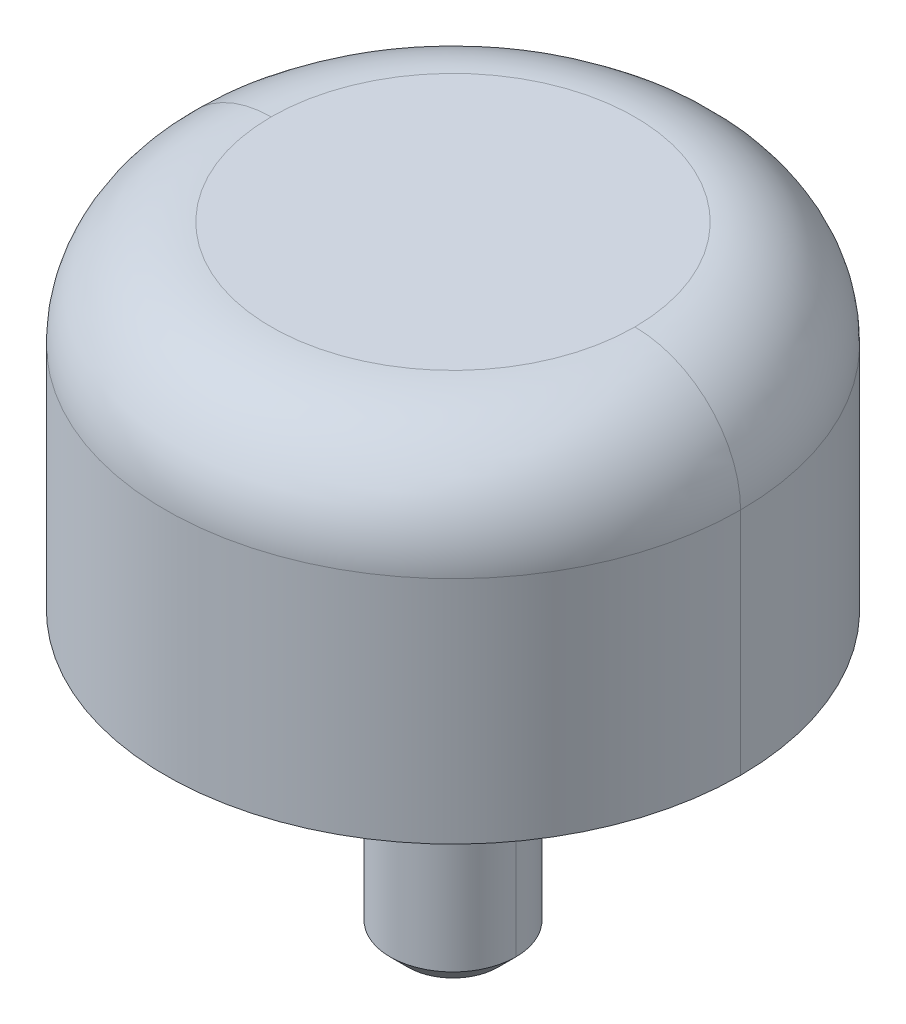
ISO-10303-21;
HEADER;
FILE_DESCRIPTION(('STEP AP214'),'2;1');
FILE_NAME('part.step','',(''),(''),'','','');
FILE_SCHEMA(('AUTOMOTIVE_DESIGN { 1 0 10303 214 1 1 1 1 }'));
ENDSEC;
DATA;
#1=APPLICATION_CONTEXT('core data for automotive mechanical design processes');
#2=APPLICATION_PROTOCOL_DEFINITION('international standard','automotive_design',2000,#1);
#3=PRODUCT_CONTEXT('',#1,'mechanical');
#4=PRODUCT('Part','Part','',(#3));
#5=PRODUCT_RELATED_PRODUCT_CATEGORY('part','',(#4));
#6=PRODUCT_DEFINITION_FORMATION('','',#4);
#7=PRODUCT_DEFINITION_CONTEXT('part definition',#1,'design');
#8=PRODUCT_DEFINITION('design','',#6,#7);
#9=PRODUCT_DEFINITION_SHAPE('','',#8);
#10=(LENGTH_UNIT() NAMED_UNIT(*) SI_UNIT(.MILLI.,.METRE.));
#11=(NAMED_UNIT(*) PLANE_ANGLE_UNIT() SI_UNIT($,.RADIAN.));
#12=(NAMED_UNIT(*) SI_UNIT($,.STERADIAN.) SOLID_ANGLE_UNIT());
#13=UNCERTAINTY_MEASURE_WITH_UNIT(LENGTH_MEASURE(1.E-05),#10,'distance_accuracy_value','');
#14=(GEOMETRIC_REPRESENTATION_CONTEXT(3) GLOBAL_UNCERTAINTY_ASSIGNED_CONTEXT((#13)) GLOBAL_UNIT_ASSIGNED_CONTEXT((#10,
#11,#12)) REPRESENTATION_CONTEXT('',''));
#15=CARTESIAN_POINT('',(0.,0.,0.));
#16=DIRECTION('',(0.,0.,1.));
#17=DIRECTION('',(1.,0.,0.));
#18=AXIS2_PLACEMENT_3D('',#15,#16,#17);
#19=CARTESIAN_POINT('',(7.04426666666667,0.,0.));
#20=DIRECTION('',(0.,1.,0.));
#21=DIRECTION('',(1.,0.,0.));
#22=AXIS2_PLACEMENT_3D('',#19,#20,#21);
#23=PLANE('',#22);
#24=CARTESIAN_POINT('',(0.,0.,0.));
#25=DIRECTION('',(0.,-1.,0.));
#26=DIRECTION('',(1.,0.,0.));
#27=AXIS2_PLACEMENT_3D('',#24,#25,#26);
#28=CIRCLE('',#27,2.24155);
#29=CARTESIAN_POINT('',(2.24155,0.,0.));
#30=VERTEX_POINT('',#29);
#31=CARTESIAN_POINT('',(-2.24155,0.,0.));
#32=VERTEX_POINT('',#31);
#33=EDGE_CURVE('P0_E39',#30,#32,#28,.T.);
#34=ORIENTED_EDGE('',*,*,#33,.F.);
#35=CARTESIAN_POINT('',(0.,0.,0.));
#36=DIRECTION('',(0.,-1.,0.));
#37=DIRECTION('',(1.,0.,0.));
#38=AXIS2_PLACEMENT_3D('',#35,#36,#37);
#39=CIRCLE('',#38,2.24155);
#40=EDGE_CURVE('P0_E114',#32,#30,#39,.T.);
#41=ORIENTED_EDGE('',*,*,#40,.F.);
#42=EDGE_LOOP('',(#34,#41));
#43=FACE_BOUND('',#42,.T.);
#44=CARTESIAN_POINT('',(0.,0.,0.));
#45=DIRECTION('',(0.,1.,0.));
#46=DIRECTION('',(-1.,0.,0.));
#47=AXIS2_PLACEMENT_3D('',#44,#45,#46);
#48=CIRCLE('',#47,9.525);
#49=CARTESIAN_POINT('',(-9.525,0.,0.));
#50=VERTEX_POINT('',#49);
#51=CARTESIAN_POINT('',(9.525,0.,0.));
#52=VERTEX_POINT('',#51);
#53=EDGE_CURVE('P0_E149',#50,#52,#48,.T.);
#54=ORIENTED_EDGE('',*,*,#53,.F.);
#55=CARTESIAN_POINT('',(0.,0.,0.));
#56=DIRECTION('',(0.,1.,0.));
#57=DIRECTION('',(-1.,0.,0.));
#58=AXIS2_PLACEMENT_3D('',#55,#56,#57);
#59=CIRCLE('',#58,9.525);
#60=EDGE_CURVE('P0_E11',#52,#50,#59,.T.);
#61=ORIENTED_EDGE('',*,*,#60,.F.);
#62=EDGE_LOOP('',(#54,#61));
#63=FACE_BOUND('',#62,.T.);
#64=ADVANCED_FACE('P0_F16',(#43,#63),#23,.F.);
#65=CARTESIAN_POINT('',(0.,11.1125,0.));
#66=DIRECTION('',(0.,1.,0.));
#67=DIRECTION('',(-1.,0.,0.));
#68=AXIS2_PLACEMENT_3D('',#65,#66,#67);
#69=CYLINDRICAL_SURFACE('',#68,9.525);
#70=DIRECTION('',(0.,1.,0.));
#71=VECTOR('',#70,1.);
#72=CARTESIAN_POINT('',(9.525,11.1125,0.));
#73=LINE('',#72,#71);
#74=CARTESIAN_POINT('',(9.525,7.6125,0.));
#75=VERTEX_POINT('',#74);
#76=EDGE_CURVE('P0_E153',#52,#75,#73,.T.);
#77=ORIENTED_EDGE('',*,*,#76,.F.);
#78=ORIENTED_EDGE('',*,*,#60,.T.);
#79=DIRECTION('',(0.,1.,0.));
#80=VECTOR('',#79,1.);
#81=CARTESIAN_POINT('',(-9.525,11.1125,0.));
#82=LINE('',#81,#80);
#83=CARTESIAN_POINT('',(-9.525,7.6125,0.));
#84=VERTEX_POINT('',#83);
#85=EDGE_CURVE('P0_E148',#50,#84,#82,.T.);
#86=ORIENTED_EDGE('',*,*,#85,.T.);
#87=CARTESIAN_POINT('',(0.,7.6125,0.));
#88=DIRECTION('',(0.,1.,0.));
#89=DIRECTION('',(-1.,0.,0.));
#90=AXIS2_PLACEMENT_3D('',#87,#88,#89);
#91=CIRCLE('',#90,9.525);
#92=EDGE_CURVE('P0_E26',#75,#84,#91,.T.);
#93=ORIENTED_EDGE('',*,*,#92,.F.);
#94=EDGE_LOOP('',(#77,#78,#86,#93));
#95=FACE_BOUND('',#94,.T.);
#96=ADVANCED_FACE('P0_F210',(#95),#69,.T.);
#97=CARTESIAN_POINT('',(0.,7.6125,0.));
#98=DIRECTION('',(0.,1.,0.));
#99=DIRECTION('',(-1.,0.,0.));
#100=AXIS2_PLACEMENT_3D('',#97,#98,#99);
#101=TOROIDAL_SURFACE('',#100,6.025,3.5);
#102=CARTESIAN_POINT('',(6.025,7.6125,0.));
#103=DIRECTION('',(0.,0.,1.));
#104=DIRECTION('',(1.,0.,0.));
#105=AXIS2_PLACEMENT_3D('',#102,#103,#104);
#106=CIRCLE('',#105,3.5);
#107=CARTESIAN_POINT('',(6.025,11.1125,0.));
#108=VERTEX_POINT('',#107);
#109=EDGE_CURVE('P0_E143',#75,#108,#106,.T.);
#110=ORIENTED_EDGE('',*,*,#109,.F.);
#111=ORIENTED_EDGE('',*,*,#92,.T.);
#112=CARTESIAN_POINT('',(-6.025,7.6125,0.));
#113=DIRECTION('',(0.,0.,-1.));
#114=DIRECTION('',(-1.,0.,0.));
#115=AXIS2_PLACEMENT_3D('',#112,#113,#114);
#116=CIRCLE('',#115,3.5);
#117=CARTESIAN_POINT('',(-6.025,11.1125,0.));
#118=VERTEX_POINT('',#117);
#119=EDGE_CURVE('P0_E163',#84,#118,#116,.T.);
#120=ORIENTED_EDGE('',*,*,#119,.T.);
#121=CARTESIAN_POINT('',(0.,11.1125,0.));
#122=DIRECTION('',(0.,1.,0.));
#123=DIRECTION('',(-1.,0.,0.));
#124=AXIS2_PLACEMENT_3D('',#121,#122,#123);
#125=CIRCLE('',#124,6.025);
#126=EDGE_CURVE('P0_E139',#108,#118,#125,.T.);
#127=ORIENTED_EDGE('',*,*,#126,.F.);
#128=EDGE_LOOP('',(#110,#111,#120,#127));
#129=FACE_BOUND('',#128,.T.);
#130=ADVANCED_FACE('P0_F204',(#129),#101,.T.);
#131=CARTESIAN_POINT('',(0.,11.1125,0.));
#132=DIRECTION('',(0.,-1.,0.));
#133=DIRECTION('',(-1.,0.,0.));
#134=AXIS2_PLACEMENT_3D('',#131,#132,#133);
#135=PLANE('',#134);
#136=CARTESIAN_POINT('',(0.,11.1125,0.));
#137=DIRECTION('',(0.,1.,0.));
#138=DIRECTION('',(-1.,0.,0.));
#139=AXIS2_PLACEMENT_3D('',#136,#137,#138);
#140=CIRCLE('',#139,6.025);
#141=EDGE_CURVE('P0_E147',#118,#108,#140,.T.);
#142=ORIENTED_EDGE('',*,*,#141,.T.);
#143=ORIENTED_EDGE('',*,*,#126,.T.);
#144=EDGE_LOOP('',(#142,#143));
#145=FACE_BOUND('',#144,.T.);
#146=ADVANCED_FACE('P0_F199',(#145),#135,.F.);
#147=CARTESIAN_POINT('',(0.,-9.525,0.));
#148=DIRECTION('',(0.,-1.,0.));
#149=DIRECTION('',(1.,0.,0.));
#150=AXIS2_PLACEMENT_3D('',#147,#148,#149);
#151=CYLINDRICAL_SURFACE('',#150,2.0828);
#152=DIRECTION('',(0.,-1.,0.));
#153=VECTOR('',#152,1.);
#154=CARTESIAN_POINT('',(-2.0828,-9.525,0.));
#155=LINE('',#154,#153);
#156=CARTESIAN_POINT('',(-2.0828,5.205419462737,0.));
#157=VERTEX_POINT('',#156);
#158=CARTESIAN_POINT('',(-2.0828,0.15875,0.));
#159=VERTEX_POINT('',#158);
#160=EDGE_CURVE('P0_E127',#157,#159,#155,.T.);
#161=ORIENTED_EDGE('',*,*,#160,.F.);
#162=CARTESIAN_POINT('',(0.,5.205419462737,0.));
#163=DIRECTION('',(0.,-1.,0.));
#164=DIRECTION('',(1.,0.,0.));
#165=AXIS2_PLACEMENT_3D('',#162,#163,#164);
#166=CIRCLE('',#165,2.0828);
#167=CARTESIAN_POINT('',(2.0828,5.205419462737,0.));
#168=VERTEX_POINT('',#167);
#169=EDGE_CURVE('P0_E20',#168,#157,#166,.T.);
#170=ORIENTED_EDGE('',*,*,#169,.F.);
#171=DIRECTION('',(0.,-1.,0.));
#172=VECTOR('',#171,1.);
#173=CARTESIAN_POINT('',(2.0828,-9.525,0.));
#174=LINE('',#173,#172);
#175=CARTESIAN_POINT('',(2.0828,0.15875,0.));
#176=VERTEX_POINT('',#175);
#177=EDGE_CURVE('P0_E118',#168,#176,#174,.T.);
#178=ORIENTED_EDGE('',*,*,#177,.T.);
#179=CARTESIAN_POINT('',(0.,0.15875,0.));
#180=DIRECTION('',(0.,-1.,0.));
#181=DIRECTION('',(1.,0.,0.));
#182=AXIS2_PLACEMENT_3D('',#179,#180,#181);
#183=CIRCLE('',#182,2.0828);
#184=EDGE_CURVE('P0_E96',#176,#159,#183,.T.);
#185=ORIENTED_EDGE('',*,*,#184,.T.);
#186=EDGE_LOOP('',(#161,#170,#178,#185));
#187=FACE_BOUND('',#186,.T.);
#188=ADVANCED_FACE('P0_F18',(#187),#151,.F.);
#189=CARTESIAN_POINT('',(0.,5.205419462737,0.));
#190=DIRECTION('',(0.,-1.,0.));
#191=DIRECTION('',(1.,0.,0.));
#192=AXIS2_PLACEMENT_3D('',#189,#190,#191);
#193=CONICAL_SURFACE('',#192,2.0828,1.22173047639603);
#194=DIRECTION('',(-0.939692620785907,-0.342020143325671,0.));
#195=VECTOR('',#194,1.);
#196=CARTESIAN_POINT('',(-2.0828,5.205419462737,0.));
#197=LINE('',#196,#195);
#198=CARTESIAN_POINT('',(0.,5.96349666666665,0.));
#199=VERTEX_POINT('',#198);
#200=EDGE_CURVE('P0_E158',#199,#157,#197,.T.);
#201=ORIENTED_EDGE('',*,*,#200,.F.);
#202=DIRECTION('',(0.939692620785907,-0.342020143325671,0.));
#203=VECTOR('',#202,1.);
#204=CARTESIAN_POINT('',(2.0828,5.205419462737,0.));
#205=LINE('',#204,#203);
#206=EDGE_CURVE('P0_E124',#199,#168,#205,.T.);
#207=ORIENTED_EDGE('',*,*,#206,.T.);
#208=ORIENTED_EDGE('',*,*,#169,.T.);
#209=EDGE_LOOP('',(#201,#207,#208));
#210=FACE_BOUND('',#209,.T.);
#211=ADVANCED_FACE('P0_F229',(#210),#193,.F.);
#212=CARTESIAN_POINT('',(0.,0.,0.));
#213=DIRECTION('',(0.,-1.,0.));
#214=DIRECTION('',(1.,0.,0.));
#215=AXIS2_PLACEMENT_3D('',#212,#213,#214);
#216=CONICAL_SURFACE('',#215,2.24155,0.785398163397446);
#217=DIRECTION('',(-0.707106781186546,-0.707106781186549,0.));
#218=VECTOR('',#217,1.);
#219=CARTESIAN_POINT('',(-2.24155,0.,0.));
#220=LINE('',#219,#218);
#221=EDGE_CURVE('P0_E102',#159,#32,#220,.T.);
#222=ORIENTED_EDGE('',*,*,#221,.F.);
#223=ORIENTED_EDGE('',*,*,#184,.F.);
#224=DIRECTION('',(0.707106781186546,-0.707106781186549,0.));
#225=VECTOR('',#224,1.);
#226=CARTESIAN_POINT('',(2.24155,0.,0.));
#227=LINE('',#226,#225);
#228=EDGE_CURVE('P0_E99',#176,#30,#227,.T.);
#229=ORIENTED_EDGE('',*,*,#228,.T.);
#230=ORIENTED_EDGE('',*,*,#33,.T.);
#231=EDGE_LOOP('',(#222,#223,#229,#230));
#232=FACE_BOUND('',#231,.T.);
#233=ADVANCED_FACE('P0_F98',(#232),#216,.F.);
#234=CARTESIAN_POINT('',(0.,0.,0.));
#235=DIRECTION('',(0.,-1.,0.));
#236=DIRECTION('',(1.,0.,0.));
#237=AXIS2_PLACEMENT_3D('',#234,#235,#236);
#238=CONICAL_SURFACE('',#237,2.24155,0.785398163397446);
#239=CARTESIAN_POINT('',(0.,0.15875,0.));
#240=DIRECTION('',(0.,-1.,0.));
#241=DIRECTION('',(1.,0.,0.));
#242=AXIS2_PLACEMENT_3D('',#239,#240,#241);
#243=CIRCLE('',#242,2.0828);
#244=EDGE_CURVE('P0_E112',#159,#176,#243,.T.);
#245=ORIENTED_EDGE('',*,*,#244,.F.);
#246=ORIENTED_EDGE('',*,*,#221,.T.);
#247=ORIENTED_EDGE('',*,*,#40,.T.);
#248=ORIENTED_EDGE('',*,*,#228,.F.);
#249=EDGE_LOOP('',(#245,#246,#247,#248));
#250=FACE_BOUND('',#249,.T.);
#251=ADVANCED_FACE('P0_F110',(#250),#238,.F.);
#252=CARTESIAN_POINT('',(0.,5.205419462737,0.));
#253=DIRECTION('',(0.,-1.,0.));
#254=DIRECTION('',(1.,0.,0.));
#255=AXIS2_PLACEMENT_3D('',#252,#253,#254);
#256=CONICAL_SURFACE('',#255,2.0828,1.22173047639603);
#257=ORIENTED_EDGE('',*,*,#206,.F.);
#258=ORIENTED_EDGE('',*,*,#200,.T.);
#259=CARTESIAN_POINT('',(0.,5.205419462737,0.));
#260=DIRECTION('',(0.,-1.,0.));
#261=DIRECTION('',(1.,0.,0.));
#262=AXIS2_PLACEMENT_3D('',#259,#260,#261);
#263=CIRCLE('',#262,2.0828);
#264=EDGE_CURVE('P0_E135',#157,#168,#263,.T.);
#265=ORIENTED_EDGE('',*,*,#264,.T.);
#266=EDGE_LOOP('',(#257,#258,#265));
#267=FACE_BOUND('',#266,.T.);
#268=ADVANCED_FACE('P0_F221',(#267),#256,.F.);
#269=CARTESIAN_POINT('',(0.,-9.525,0.));
#270=DIRECTION('',(0.,-1.,0.));
#271=DIRECTION('',(1.,0.,0.));
#272=AXIS2_PLACEMENT_3D('',#269,#270,#271);
#273=CYLINDRICAL_SURFACE('',#272,2.0828);
#274=ORIENTED_EDGE('',*,*,#264,.F.);
#275=ORIENTED_EDGE('',*,*,#160,.T.);
#276=ORIENTED_EDGE('',*,*,#244,.T.);
#277=ORIENTED_EDGE('',*,*,#177,.F.);
#278=EDGE_LOOP('',(#274,#275,#276,#277));
#279=FACE_BOUND('',#278,.T.);
#280=ADVANCED_FACE('P0_F126',(#279),#273,.F.);
#281=CARTESIAN_POINT('',(0.,7.6125,0.));
#282=DIRECTION('',(0.,1.,0.));
#283=DIRECTION('',(-1.,0.,0.));
#284=AXIS2_PLACEMENT_3D('',#281,#282,#283);
#285=TOROIDAL_SURFACE('',#284,6.025,3.5);
#286=CARTESIAN_POINT('',(0.,7.6125,0.));
#287=DIRECTION('',(0.,1.,0.));
#288=DIRECTION('',(-1.,0.,0.));
#289=AXIS2_PLACEMENT_3D('',#286,#287,#288);
#290=CIRCLE('',#289,9.525);
#291=EDGE_CURVE('P0_E155',#84,#75,#290,.T.);
#292=ORIENTED_EDGE('',*,*,#291,.T.);
#293=ORIENTED_EDGE('',*,*,#109,.T.);
#294=ORIENTED_EDGE('',*,*,#141,.F.);
#295=ORIENTED_EDGE('',*,*,#119,.F.);
#296=EDGE_LOOP('',(#292,#293,#294,#295));
#297=FACE_BOUND('',#296,.T.);
#298=ADVANCED_FACE('P0_F206',(#297),#285,.T.);
#299=CARTESIAN_POINT('',(0.,11.1125,0.));
#300=DIRECTION('',(0.,1.,0.));
#301=DIRECTION('',(-1.,0.,0.));
#302=AXIS2_PLACEMENT_3D('',#299,#300,#301);
#303=CYLINDRICAL_SURFACE('',#302,9.525);
#304=ORIENTED_EDGE('',*,*,#53,.T.);
#305=ORIENTED_EDGE('',*,*,#76,.T.);
#306=ORIENTED_EDGE('',*,*,#291,.F.);
#307=ORIENTED_EDGE('',*,*,#85,.F.);
#308=EDGE_LOOP('',(#304,#305,#306,#307));
#309=FACE_BOUND('',#308,.T.);
#310=ADVANCED_FACE('P0_F209',(#309),#303,.T.);
#311=CLOSED_SHELL('',(#64,#96,#130,#146,#188,#211,#233,#251,#268,#280,#298,#310));
#312=MANIFOLD_SOLID_BREP('P0_B1',#311);
#313=CARTESIAN_POINT('',(0.,-9.525,0.));
#314=DIRECTION('',(0.,1.,0.));
#315=DIRECTION('',(-1.,0.,0.));
#316=AXIS2_PLACEMENT_3D('',#313,#314,#315);
#317=CONICAL_SURFACE('',#316,1.48748750000001,0.785398163397447);
#318=DIRECTION('',(0.707106781186547,0.707106781186549,0.));
#319=VECTOR('',#318,1.);
#320=CARTESIAN_POINT('',(1.4874875,-9.525,0.));
#321=LINE('',#320,#319);
#322=CARTESIAN_POINT('',(1.4874875,-9.525,0.));
#323=VERTEX_POINT('',#322);
#324=CARTESIAN_POINT('',(2.0828,-8.92968750000001,0.));
#325=VERTEX_POINT('',#324);
#326=EDGE_CURVE('P1_E93',#323,#325,#321,.T.);
#327=ORIENTED_EDGE('',*,*,#326,.F.);
#328=CARTESIAN_POINT('',(0.,-9.525,0.));
#329=DIRECTION('',(0.,-1.,0.));
#330=DIRECTION('',(1.,0.,0.));
#331=AXIS2_PLACEMENT_3D('',#328,#329,#330);
#332=CIRCLE('',#331,1.48748750000001);
#333=CARTESIAN_POINT('',(-1.48748750000001,-9.525,0.));
#334=VERTEX_POINT('',#333);
#335=EDGE_CURVE('P1_E85',#334,#323,#332,.T.);
#336=ORIENTED_EDGE('',*,*,#335,.F.);
#337=DIRECTION('',(-0.707106781186547,0.707106781186549,0.));
#338=VECTOR('',#337,1.);
#339=CARTESIAN_POINT('',(-1.48748750000001,-9.525,0.));
#340=LINE('',#339,#338);
#341=CARTESIAN_POINT('',(-2.0828,-8.92968750000001,0.));
#342=VERTEX_POINT('',#341);
#343=EDGE_CURVE('P1_E83',#334,#342,#340,.T.);
#344=ORIENTED_EDGE('',*,*,#343,.T.);
#345=CARTESIAN_POINT('',(0.,-8.92968750000001,0.));
#346=DIRECTION('',(0.,1.,0.));
#347=DIRECTION('',(1.,0.,0.));
#348=AXIS2_PLACEMENT_3D('',#345,#346,#347);
#349=CIRCLE('',#348,2.0828);
#350=EDGE_CURVE('P1_E11',#325,#342,#349,.T.);
#351=ORIENTED_EDGE('',*,*,#350,.F.);
#352=EDGE_LOOP('',(#327,#336,#344,#351));
#353=FACE_BOUND('',#352,.T.);
#354=ADVANCED_FACE('P1_F16',(#353),#317,.T.);
#355=CARTESIAN_POINT('',(0.,5.205419462737,0.));
#356=DIRECTION('',(0.,-1.,0.));
#357=DIRECTION('',(1.,0.,0.));
#358=AXIS2_PLACEMENT_3D('',#355,#356,#357);
#359=CONICAL_SURFACE('',#358,2.0828,1.22173047639603);
#360=DIRECTION('',(-0.939692620785907,-0.342020143325671,0.));
#361=VECTOR('',#360,1.);
#362=CARTESIAN_POINT('',(-2.0828,5.205419462737,0.));
#363=LINE('',#362,#361);
#364=CARTESIAN_POINT('',(0.,5.96349666666665,0.));
#365=VERTEX_POINT('',#364);
#366=CARTESIAN_POINT('',(-2.0828,5.205419462737,0.));
#367=VERTEX_POINT('',#366);
#368=EDGE_CURVE('P1_E104',#365,#367,#363,.T.);
#369=ORIENTED_EDGE('',*,*,#368,.F.);
#370=DIRECTION('',(0.939692620785907,-0.342020143325671,0.));
#371=VECTOR('',#370,1.);
#372=CARTESIAN_POINT('',(2.0828,5.205419462737,0.));
#373=LINE('',#372,#371);
#374=CARTESIAN_POINT('',(2.0828,5.205419462737,0.));
#375=VERTEX_POINT('',#374);
#376=EDGE_CURVE('P1_E90',#365,#375,#373,.T.);
#377=ORIENTED_EDGE('',*,*,#376,.T.);
#378=CARTESIAN_POINT('',(0.,5.205419462737,0.));
#379=DIRECTION('',(0.,-1.,0.));
#380=DIRECTION('',(1.,0.,0.));
#381=AXIS2_PLACEMENT_3D('',#378,#379,#380);
#382=CIRCLE('',#381,2.0828);
#383=EDGE_CURVE('P1_E27',#367,#375,#382,.T.);
#384=ORIENTED_EDGE('',*,*,#383,.F.);
#385=EDGE_LOOP('',(#369,#377,#384));
#386=FACE_BOUND('',#385,.T.);
#387=ADVANCED_FACE('P1_F219',(#386),#359,.T.);
#388=CARTESIAN_POINT('',(0.,-9.525,0.));
#389=DIRECTION('',(0.,-1.,0.));
#390=DIRECTION('',(1.,0.,0.));
#391=AXIS2_PLACEMENT_3D('',#388,#389,#390);
#392=CYLINDRICAL_SURFACE('',#391,2.0828);
#393=DIRECTION('',(0.,-1.,0.));
#394=VECTOR('',#393,1.);
#395=CARTESIAN_POINT('',(-2.0828,-9.525,0.));
#396=LINE('',#395,#394);
#397=EDGE_CURVE('P1_E69',#367,#342,#396,.T.);
#398=ORIENTED_EDGE('',*,*,#397,.F.);
#399=ORIENTED_EDGE('',*,*,#383,.T.);
#400=DIRECTION('',(0.,-1.,0.));
#401=VECTOR('',#400,1.);
#402=CARTESIAN_POINT('',(2.0828,-9.525,0.));
#403=LINE('',#402,#401);
#404=EDGE_CURVE('P1_E20',#375,#325,#403,.T.);
#405=ORIENTED_EDGE('',*,*,#404,.T.);
#406=ORIENTED_EDGE('',*,*,#350,.T.);
#407=EDGE_LOOP('',(#398,#399,#405,#406));
#408=FACE_BOUND('',#407,.T.);
#409=ADVANCED_FACE('P1_F68',(#408),#392,.T.);
#410=CARTESIAN_POINT('',(2.0828,-9.525,0.));
#411=DIRECTION('',(0.,-1.,0.));
#412=DIRECTION('',(-1.,0.,0.));
#413=AXIS2_PLACEMENT_3D('',#410,#411,#412);
#414=PLANE('',#413);
#415=ORIENTED_EDGE('',*,*,#335,.T.);
#416=CARTESIAN_POINT('',(0.,-9.525,0.));
#417=DIRECTION('',(0.,-1.,0.));
#418=DIRECTION('',(1.,0.,0.));
#419=AXIS2_PLACEMENT_3D('',#416,#417,#418);
#420=CIRCLE('',#419,1.48748750000001);
#421=EDGE_CURVE('P1_E101',#323,#334,#420,.T.);
#422=ORIENTED_EDGE('',*,*,#421,.T.);
#423=EDGE_LOOP('',(#415,#422));
#424=FACE_BOUND('',#423,.T.);
#425=ADVANCED_FACE('P1_F123',(#424),#414,.T.);
#426=CARTESIAN_POINT('',(0.,-9.525,0.));
#427=DIRECTION('',(0.,-1.,0.));
#428=DIRECTION('',(1.,0.,0.));
#429=AXIS2_PLACEMENT_3D('',#426,#427,#428);
#430=CYLINDRICAL_SURFACE('',#429,2.0828);
#431=CARTESIAN_POINT('',(0.,5.205419462737,0.));
#432=DIRECTION('',(0.,-1.,0.));
#433=DIRECTION('',(1.,0.,0.));
#434=AXIS2_PLACEMENT_3D('',#431,#432,#433);
#435=CIRCLE('',#434,2.0828);
#436=EDGE_CURVE('P1_E78',#375,#367,#435,.T.);
#437=ORIENTED_EDGE('',*,*,#436,.T.);
#438=ORIENTED_EDGE('',*,*,#397,.T.);
#439=CARTESIAN_POINT('',(0.,-8.92968750000001,0.));
#440=DIRECTION('',(0.,1.,0.));
#441=DIRECTION('',(1.,0.,0.));
#442=AXIS2_PLACEMENT_3D('',#439,#440,#441);
#443=CIRCLE('',#442,2.0828);
#444=EDGE_CURVE('P1_E75',#342,#325,#443,.T.);
#445=ORIENTED_EDGE('',*,*,#444,.T.);
#446=ORIENTED_EDGE('',*,*,#404,.F.);
#447=EDGE_LOOP('',(#437,#438,#445,#446));
#448=FACE_BOUND('',#447,.T.);
#449=ADVANCED_FACE('P1_F18',(#448),#430,.T.);
#450=CARTESIAN_POINT('',(0.,5.205419462737,0.));
#451=DIRECTION('',(0.,-1.,0.));
#452=DIRECTION('',(1.,0.,0.));
#453=AXIS2_PLACEMENT_3D('',#450,#451,#452);
#454=CONICAL_SURFACE('',#453,2.0828,1.22173047639603);
#455=ORIENTED_EDGE('',*,*,#376,.F.);
#456=ORIENTED_EDGE('',*,*,#368,.T.);
#457=ORIENTED_EDGE('',*,*,#436,.F.);
#458=EDGE_LOOP('',(#455,#456,#457));
#459=FACE_BOUND('',#458,.T.);
#460=ADVANCED_FACE('P1_F192',(#459),#454,.T.);
#461=CARTESIAN_POINT('',(0.,-9.525,0.));
#462=DIRECTION('',(0.,1.,0.));
#463=DIRECTION('',(-1.,0.,0.));
#464=AXIS2_PLACEMENT_3D('',#461,#462,#463);
#465=CONICAL_SURFACE('',#464,1.48748750000001,0.785398163397447);
#466=ORIENTED_EDGE('',*,*,#421,.F.);
#467=ORIENTED_EDGE('',*,*,#326,.T.);
#468=ORIENTED_EDGE('',*,*,#444,.F.);
#469=ORIENTED_EDGE('',*,*,#343,.F.);
#470=EDGE_LOOP('',(#466,#467,#468,#469));
#471=FACE_BOUND('',#470,.T.);
#472=ADVANCED_FACE('P1_F92',(#471),#465,.T.);
#473=CLOSED_SHELL('',(#354,#387,#409,#425,#449,#460,#472));
#474=MANIFOLD_SOLID_BREP('P1_B1',#473);
#475=ADVANCED_BREP_SHAPE_REPRESENTATION('',(#18,#312,#474),#14);
#476=SHAPE_DEFINITION_REPRESENTATION(#9,#475);
ENDSEC;
END-ISO-10303-21;
